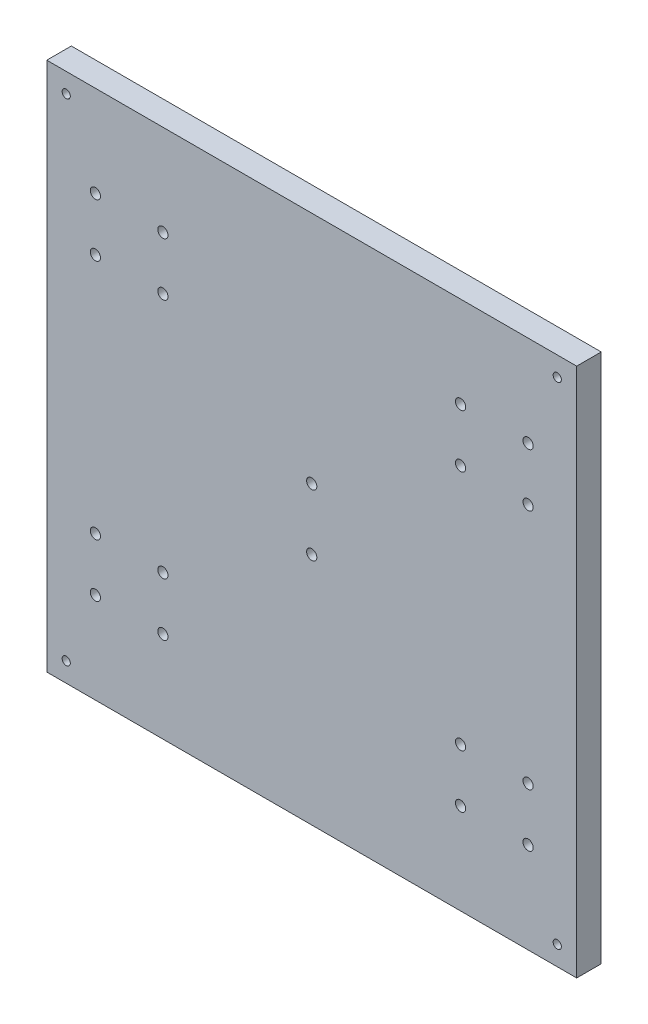
ISO-10303-21;
HEADER;
FILE_DESCRIPTION(('STEP AP214'),'2;1');
FILE_NAME('part.step','',(''),(''),'','','');
FILE_SCHEMA(('AUTOMOTIVE_DESIGN { 1 0 10303 214 1 1 1 1 }'));
ENDSEC;
DATA;
#1=APPLICATION_CONTEXT('core data for automotive mechanical design processes');
#2=APPLICATION_PROTOCOL_DEFINITION('international standard','automotive_design',2000,#1);
#3=PRODUCT_CONTEXT('',#1,'mechanical');
#4=PRODUCT('Part','Part','',(#3));
#5=PRODUCT_RELATED_PRODUCT_CATEGORY('part','',(#4));
#6=PRODUCT_DEFINITION_FORMATION('','',#4);
#7=PRODUCT_DEFINITION_CONTEXT('part definition',#1,'design');
#8=PRODUCT_DEFINITION('design','',#6,#7);
#9=PRODUCT_DEFINITION_SHAPE('','',#8);
#10=(LENGTH_UNIT() NAMED_UNIT(*) SI_UNIT(.MILLI.,.METRE.));
#11=(NAMED_UNIT(*) PLANE_ANGLE_UNIT() SI_UNIT($,.RADIAN.));
#12=(NAMED_UNIT(*) SI_UNIT($,.STERADIAN.) SOLID_ANGLE_UNIT());
#13=UNCERTAINTY_MEASURE_WITH_UNIT(LENGTH_MEASURE(1.E-05),#10,'distance_accuracy_value','');
#14=(GEOMETRIC_REPRESENTATION_CONTEXT(3) GLOBAL_UNCERTAINTY_ASSIGNED_CONTEXT((#13)) GLOBAL_UNIT_ASSIGNED_CONTEXT((#10,
#11,#12)) REPRESENTATION_CONTEXT('',''));
#15=CARTESIAN_POINT('',(0.,0.,0.));
#16=DIRECTION('',(0.,0.,1.));
#17=DIRECTION('',(1.,0.,0.));
#18=AXIS2_PLACEMENT_3D('',#15,#16,#17);
#19=CARTESIAN_POINT('',(0.,0.,12.));
#20=DIRECTION('',(0.,0.,-1.));
#21=DIRECTION('',(-1.,0.,0.));
#22=AXIS2_PLACEMENT_3D('',#19,#20,#21);
#23=PLANE('',#22);
#24=CARTESIAN_POINT('',(0.,15.,12.));
#25=DIRECTION('',(0.,0.,1.));
#26=DIRECTION('',(1.,0.,0.));
#27=AXIS2_PLACEMENT_3D('',#24,#25,#26);
#28=CIRCLE('',#27,2.5);
#29=CARTESIAN_POINT('',(2.50000000000001,15.,12.));
#30=VERTEX_POINT('',#29);
#31=EDGE_CURVE('E250',#30,#30,#28,.T.);
#32=ORIENTED_EDGE('',*,*,#31,.F.);
#33=EDGE_LOOP('',(#32));
#34=FACE_BOUND('',#33,.T.);
#35=CARTESIAN_POINT('',(0.,-15.,12.));
#36=DIRECTION('',(0.,0.,1.));
#37=DIRECTION('',(1.,0.,0.));
#38=AXIS2_PLACEMENT_3D('',#35,#36,#37);
#39=CIRCLE('',#38,2.5);
#40=CARTESIAN_POINT('',(2.50000000000002,-15.,12.));
#41=VERTEX_POINT('',#40);
#42=EDGE_CURVE('E254',#41,#41,#39,.T.);
#43=ORIENTED_EDGE('',*,*,#42,.F.);
#44=EDGE_LOOP('',(#43));
#45=FACE_BOUND('',#44,.T.);
#46=CARTESIAN_POINT('',(-105.75,85.,12.));
#47=DIRECTION('',(0.,0.,1.));
#48=DIRECTION('',(1.,0.,0.));
#49=AXIS2_PLACEMENT_3D('',#46,#47,#48);
#50=CIRCLE('',#49,2.5);
#51=CARTESIAN_POINT('',(-103.25,85.,12.));
#52=VERTEX_POINT('',#51);
#53=EDGE_CURVE('E12',#52,#52,#50,.T.);
#54=ORIENTED_EDGE('',*,*,#53,.F.);
#55=EDGE_LOOP('',(#54));
#56=FACE_BOUND('',#55,.T.);
#57=CARTESIAN_POINT('',(-72.75,85.,12.));
#58=DIRECTION('',(0.,0.,1.));
#59=DIRECTION('',(1.,0.,0.));
#60=AXIS2_PLACEMENT_3D('',#57,#58,#59);
#61=CIRCLE('',#60,2.5);
#62=CARTESIAN_POINT('',(-70.25,85.,12.));
#63=VERTEX_POINT('',#62);
#64=EDGE_CURVE('E218',#63,#63,#61,.T.);
#65=ORIENTED_EDGE('',*,*,#64,.F.);
#66=EDGE_LOOP('',(#65));
#67=FACE_BOUND('',#66,.T.);
#68=CARTESIAN_POINT('',(-105.75,59.,12.));
#69=DIRECTION('',(0.,0.,1.));
#70=DIRECTION('',(1.,0.,0.));
#71=AXIS2_PLACEMENT_3D('',#68,#69,#70);
#72=CIRCLE('',#71,2.5);
#73=CARTESIAN_POINT('',(-103.25,59.,12.));
#74=VERTEX_POINT('',#73);
#75=EDGE_CURVE('E212',#74,#74,#72,.T.);
#76=ORIENTED_EDGE('',*,*,#75,.F.);
#77=EDGE_LOOP('',(#76));
#78=FACE_BOUND('',#77,.T.);
#79=CARTESIAN_POINT('',(-72.75,59.,12.));
#80=DIRECTION('',(0.,0.,1.));
#81=DIRECTION('',(1.,0.,0.));
#82=AXIS2_PLACEMENT_3D('',#79,#80,#81);
#83=CIRCLE('',#82,2.5);
#84=CARTESIAN_POINT('',(-70.25,59.,12.));
#85=VERTEX_POINT('',#84);
#86=EDGE_CURVE('E206',#85,#85,#83,.T.);
#87=ORIENTED_EDGE('',*,*,#86,.F.);
#88=EDGE_LOOP('',(#87));
#89=FACE_BOUND('',#88,.T.);
#90=CARTESIAN_POINT('',(-120.,120.,12.));
#91=DIRECTION('',(0.,0.,1.));
#92=DIRECTION('',(1.,0.,0.));
#93=AXIS2_PLACEMENT_3D('',#90,#91,#92);
#94=CIRCLE('',#93,2.);
#95=CARTESIAN_POINT('',(-118.,120.,12.));
#96=VERTEX_POINT('',#95);
#97=EDGE_CURVE('E200',#96,#96,#94,.T.);
#98=ORIENTED_EDGE('',*,*,#97,.F.);
#99=EDGE_LOOP('',(#98));
#100=FACE_BOUND('',#99,.T.);
#101=CARTESIAN_POINT('',(-105.75,-59.,12.));
#102=DIRECTION('',(0.,0.,1.));
#103=DIRECTION('',(-1.,0.,0.));
#104=AXIS2_PLACEMENT_3D('',#101,#102,#103);
#105=CIRCLE('',#104,2.5);
#106=CARTESIAN_POINT('',(-108.25,-59.,12.));
#107=VERTEX_POINT('',#106);
#108=EDGE_CURVE('E194',#107,#107,#105,.T.);
#109=ORIENTED_EDGE('',*,*,#108,.F.);
#110=EDGE_LOOP('',(#109));
#111=FACE_BOUND('',#110,.T.);
#112=CARTESIAN_POINT('',(-105.75,-85.,12.));
#113=DIRECTION('',(0.,0.,1.));
#114=DIRECTION('',(-1.,0.,0.));
#115=AXIS2_PLACEMENT_3D('',#112,#113,#114);
#116=CIRCLE('',#115,2.5);
#117=CARTESIAN_POINT('',(-108.25,-85.,12.));
#118=VERTEX_POINT('',#117);
#119=EDGE_CURVE('E188',#118,#118,#116,.T.);
#120=ORIENTED_EDGE('',*,*,#119,.F.);
#121=EDGE_LOOP('',(#120));
#122=FACE_BOUND('',#121,.T.);
#123=CARTESIAN_POINT('',(-120.,-120.,12.));
#124=DIRECTION('',(0.,0.,1.));
#125=DIRECTION('',(-1.,0.,0.));
#126=AXIS2_PLACEMENT_3D('',#123,#124,#125);
#127=CIRCLE('',#126,2.);
#128=CARTESIAN_POINT('',(-122.,-120.,12.));
#129=VERTEX_POINT('',#128);
#130=EDGE_CURVE('E182',#129,#129,#127,.T.);
#131=ORIENTED_EDGE('',*,*,#130,.F.);
#132=EDGE_LOOP('',(#131));
#133=FACE_BOUND('',#132,.T.);
#134=CARTESIAN_POINT('',(-72.75,-59.,12.));
#135=DIRECTION('',(0.,0.,1.));
#136=DIRECTION('',(-1.,0.,0.));
#137=AXIS2_PLACEMENT_3D('',#134,#135,#136);
#138=CIRCLE('',#137,2.5);
#139=CARTESIAN_POINT('',(-75.25,-59.,12.));
#140=VERTEX_POINT('',#139);
#141=EDGE_CURVE('E176',#140,#140,#138,.T.);
#142=ORIENTED_EDGE('',*,*,#141,.F.);
#143=EDGE_LOOP('',(#142));
#144=FACE_BOUND('',#143,.T.);
#145=CARTESIAN_POINT('',(-72.75,-85.,12.));
#146=DIRECTION('',(0.,0.,1.));
#147=DIRECTION('',(-1.,0.,0.));
#148=AXIS2_PLACEMENT_3D('',#145,#146,#147);
#149=CIRCLE('',#148,2.5);
#150=CARTESIAN_POINT('',(-75.25,-85.,12.));
#151=VERTEX_POINT('',#150);
#152=EDGE_CURVE('E170',#151,#151,#149,.T.);
#153=ORIENTED_EDGE('',*,*,#152,.F.);
#154=EDGE_LOOP('',(#153));
#155=FACE_BOUND('',#154,.T.);
#156=CARTESIAN_POINT('',(72.75,-85.,12.));
#157=DIRECTION('',(0.,0.,1.));
#158=DIRECTION('',(1.,0.,0.));
#159=AXIS2_PLACEMENT_3D('',#156,#157,#158);
#160=CIRCLE('',#159,2.5);
#161=CARTESIAN_POINT('',(75.25,-85.,12.));
#162=VERTEX_POINT('',#161);
#163=EDGE_CURVE('E164',#162,#162,#160,.T.);
#164=ORIENTED_EDGE('',*,*,#163,.F.);
#165=EDGE_LOOP('',(#164));
#166=FACE_BOUND('',#165,.T.);
#167=CARTESIAN_POINT('',(72.75,-59.,12.));
#168=DIRECTION('',(0.,0.,1.));
#169=DIRECTION('',(1.,0.,0.));
#170=AXIS2_PLACEMENT_3D('',#167,#168,#169);
#171=CIRCLE('',#170,2.5);
#172=CARTESIAN_POINT('',(75.25,-59.,12.));
#173=VERTEX_POINT('',#172);
#174=EDGE_CURVE('E158',#173,#173,#171,.T.);
#175=ORIENTED_EDGE('',*,*,#174,.F.);
#176=EDGE_LOOP('',(#175));
#177=FACE_BOUND('',#176,.T.);
#178=CARTESIAN_POINT('',(120.,-120.,12.));
#179=DIRECTION('',(0.,0.,1.));
#180=DIRECTION('',(1.,0.,0.));
#181=AXIS2_PLACEMENT_3D('',#178,#179,#180);
#182=CIRCLE('',#181,2.);
#183=CARTESIAN_POINT('',(122.,-120.,12.));
#184=VERTEX_POINT('',#183);
#185=EDGE_CURVE('E152',#184,#184,#182,.T.);
#186=ORIENTED_EDGE('',*,*,#185,.F.);
#187=EDGE_LOOP('',(#186));
#188=FACE_BOUND('',#187,.T.);
#189=CARTESIAN_POINT('',(105.75,-85.,12.));
#190=DIRECTION('',(0.,0.,1.));
#191=DIRECTION('',(1.,0.,0.));
#192=AXIS2_PLACEMENT_3D('',#189,#190,#191);
#193=CIRCLE('',#192,2.5);
#194=CARTESIAN_POINT('',(108.25,-85.,12.));
#195=VERTEX_POINT('',#194);
#196=EDGE_CURVE('E146',#195,#195,#193,.T.);
#197=ORIENTED_EDGE('',*,*,#196,.F.);
#198=EDGE_LOOP('',(#197));
#199=FACE_BOUND('',#198,.T.);
#200=CARTESIAN_POINT('',(105.75,-59.,12.));
#201=DIRECTION('',(0.,0.,1.));
#202=DIRECTION('',(1.,0.,0.));
#203=AXIS2_PLACEMENT_3D('',#200,#201,#202);
#204=CIRCLE('',#203,2.5);
#205=CARTESIAN_POINT('',(108.25,-59.,12.));
#206=VERTEX_POINT('',#205);
#207=EDGE_CURVE('E140',#206,#206,#204,.T.);
#208=ORIENTED_EDGE('',*,*,#207,.F.);
#209=EDGE_LOOP('',(#208));
#210=FACE_BOUND('',#209,.T.);
#211=CARTESIAN_POINT('',(120.,120.,12.));
#212=DIRECTION('',(0.,0.,1.));
#213=DIRECTION('',(-1.,0.,0.));
#214=AXIS2_PLACEMENT_3D('',#211,#212,#213);
#215=CIRCLE('',#214,2.);
#216=CARTESIAN_POINT('',(118.,120.,12.));
#217=VERTEX_POINT('',#216);
#218=EDGE_CURVE('E134',#217,#217,#215,.T.);
#219=ORIENTED_EDGE('',*,*,#218,.F.);
#220=EDGE_LOOP('',(#219));
#221=FACE_BOUND('',#220,.T.);
#222=CARTESIAN_POINT('',(72.75,59.,12.));
#223=DIRECTION('',(0.,0.,1.));
#224=DIRECTION('',(-1.,0.,0.));
#225=AXIS2_PLACEMENT_3D('',#222,#223,#224);
#226=CIRCLE('',#225,2.5);
#227=CARTESIAN_POINT('',(70.25,59.,12.));
#228=VERTEX_POINT('',#227);
#229=EDGE_CURVE('E128',#228,#228,#226,.T.);
#230=ORIENTED_EDGE('',*,*,#229,.F.);
#231=EDGE_LOOP('',(#230));
#232=FACE_BOUND('',#231,.T.);
#233=CARTESIAN_POINT('',(105.75,59.,12.));
#234=DIRECTION('',(0.,0.,1.));
#235=DIRECTION('',(-1.,0.,0.));
#236=AXIS2_PLACEMENT_3D('',#233,#234,#235);
#237=CIRCLE('',#236,2.5);
#238=CARTESIAN_POINT('',(103.25,59.,12.));
#239=VERTEX_POINT('',#238);
#240=EDGE_CURVE('E122',#239,#239,#237,.T.);
#241=ORIENTED_EDGE('',*,*,#240,.F.);
#242=EDGE_LOOP('',(#241));
#243=FACE_BOUND('',#242,.T.);
#244=CARTESIAN_POINT('',(72.75,85.,12.));
#245=DIRECTION('',(0.,0.,1.));
#246=DIRECTION('',(-1.,0.,0.));
#247=AXIS2_PLACEMENT_3D('',#244,#245,#246);
#248=CIRCLE('',#247,2.5);
#249=CARTESIAN_POINT('',(70.25,85.,12.));
#250=VERTEX_POINT('',#249);
#251=EDGE_CURVE('E116',#250,#250,#248,.T.);
#252=ORIENTED_EDGE('',*,*,#251,.F.);
#253=EDGE_LOOP('',(#252));
#254=FACE_BOUND('',#253,.T.);
#255=CARTESIAN_POINT('',(105.75,85.,12.));
#256=DIRECTION('',(0.,0.,1.));
#257=DIRECTION('',(-1.,0.,0.));
#258=AXIS2_PLACEMENT_3D('',#255,#256,#257);
#259=CIRCLE('',#258,2.5);
#260=CARTESIAN_POINT('',(103.25,85.,12.));
#261=VERTEX_POINT('',#260);
#262=EDGE_CURVE('E110',#261,#261,#259,.T.);
#263=ORIENTED_EDGE('',*,*,#262,.F.);
#264=EDGE_LOOP('',(#263));
#265=FACE_BOUND('',#264,.T.);
#266=DIRECTION('',(0.,1.,0.));
#267=VECTOR('',#266,1.);
#268=CARTESIAN_POINT('',(129.5,-129.5,12.));
#269=LINE('',#268,#267);
#270=CARTESIAN_POINT('',(129.5,-129.5,12.));
#271=VERTEX_POINT('',#270);
#272=CARTESIAN_POINT('',(129.5,129.5,12.));
#273=VERTEX_POINT('',#272);
#274=EDGE_CURVE('E98',#271,#273,#269,.T.);
#275=ORIENTED_EDGE('',*,*,#274,.T.);
#276=DIRECTION('',(-1.,0.,0.));
#277=VECTOR('',#276,1.);
#278=CARTESIAN_POINT('',(-129.5,129.5,12.));
#279=LINE('',#278,#277);
#280=CARTESIAN_POINT('',(-129.5,129.5,12.));
#281=VERTEX_POINT('',#280);
#282=EDGE_CURVE('E101',#273,#281,#279,.T.);
#283=ORIENTED_EDGE('',*,*,#282,.T.);
#284=DIRECTION('',(0.,-1.,0.));
#285=VECTOR('',#284,1.);
#286=CARTESIAN_POINT('',(-129.5,-129.5,12.));
#287=LINE('',#286,#285);
#288=CARTESIAN_POINT('',(-129.5,-129.5,12.));
#289=VERTEX_POINT('',#288);
#290=EDGE_CURVE('E49',#281,#289,#287,.T.);
#291=ORIENTED_EDGE('',*,*,#290,.T.);
#292=DIRECTION('',(1.,0.,0.));
#293=VECTOR('',#292,1.);
#294=CARTESIAN_POINT('',(-129.5,-129.5,12.));
#295=LINE('',#294,#293);
#296=EDGE_CURVE('E81',#289,#271,#295,.T.);
#297=ORIENTED_EDGE('',*,*,#296,.T.);
#298=EDGE_LOOP('',(#275,#283,#291,#297));
#299=FACE_BOUND('',#298,.T.);
#300=ADVANCED_FACE('F34',(#34,#45,#56,#67,#78,#89,#100,#111,#122,#133,#144,#155,#166,#177,#188,
#199,#210,#221,#232,#243,#254,#265,#299),#23,.F.);
#301=CARTESIAN_POINT('',(0.,0.,0.));
#302=DIRECTION('',(0.,0.,-1.));
#303=DIRECTION('',(-1.,0.,0.));
#304=AXIS2_PLACEMENT_3D('',#301,#302,#303);
#305=PLANE('',#304);
#306=CARTESIAN_POINT('',(0.,15.,0.));
#307=DIRECTION('',(0.,0.,1.));
#308=DIRECTION('',(1.,0.,0.));
#309=AXIS2_PLACEMENT_3D('',#306,#307,#308);
#310=CIRCLE('',#309,2.5);
#311=CARTESIAN_POINT('',(2.50000000000001,15.,0.));
#312=VERTEX_POINT('',#311);
#313=EDGE_CURVE('E102',#312,#312,#310,.T.);
#314=ORIENTED_EDGE('',*,*,#313,.T.);
#315=EDGE_LOOP('',(#314));
#316=FACE_BOUND('',#315,.T.);
#317=CARTESIAN_POINT('',(0.,-15.,0.));
#318=DIRECTION('',(0.,0.,1.));
#319=DIRECTION('',(1.,0.,0.));
#320=AXIS2_PLACEMENT_3D('',#317,#318,#319);
#321=CIRCLE('',#320,2.5);
#322=CARTESIAN_POINT('',(2.50000000000002,-15.,0.));
#323=VERTEX_POINT('',#322);
#324=EDGE_CURVE('E303',#323,#323,#321,.T.);
#325=ORIENTED_EDGE('',*,*,#324,.T.);
#326=EDGE_LOOP('',(#325));
#327=FACE_BOUND('',#326,.T.);
#328=CARTESIAN_POINT('',(105.75,85.,0.));
#329=DIRECTION('',(0.,0.,1.));
#330=DIRECTION('',(-1.,0.,0.));
#331=AXIS2_PLACEMENT_3D('',#328,#329,#330);
#332=CIRCLE('',#331,2.5);
#333=CARTESIAN_POINT('',(103.25,85.,0.));
#334=VERTEX_POINT('',#333);
#335=EDGE_CURVE('E107',#334,#334,#332,.T.);
#336=ORIENTED_EDGE('',*,*,#335,.T.);
#337=EDGE_LOOP('',(#336));
#338=FACE_BOUND('',#337,.T.);
#339=CARTESIAN_POINT('',(105.75,59.,0.));
#340=DIRECTION('',(0.,0.,1.));
#341=DIRECTION('',(-1.,0.,0.));
#342=AXIS2_PLACEMENT_3D('',#339,#340,#341);
#343=CIRCLE('',#342,2.5);
#344=CARTESIAN_POINT('',(103.25,59.,0.));
#345=VERTEX_POINT('',#344);
#346=EDGE_CURVE('E119',#345,#345,#343,.T.);
#347=ORIENTED_EDGE('',*,*,#346,.T.);
#348=EDGE_LOOP('',(#347));
#349=FACE_BOUND('',#348,.T.);
#350=CARTESIAN_POINT('',(120.,120.,0.));
#351=DIRECTION('',(0.,0.,1.));
#352=DIRECTION('',(-1.,0.,0.));
#353=AXIS2_PLACEMENT_3D('',#350,#351,#352);
#354=CIRCLE('',#353,2.);
#355=CARTESIAN_POINT('',(118.,120.,0.));
#356=VERTEX_POINT('',#355);
#357=EDGE_CURVE('E131',#356,#356,#354,.T.);
#358=ORIENTED_EDGE('',*,*,#357,.T.);
#359=EDGE_LOOP('',(#358));
#360=FACE_BOUND('',#359,.T.);
#361=CARTESIAN_POINT('',(105.75,-85.,0.));
#362=DIRECTION('',(0.,0.,1.));
#363=DIRECTION('',(1.,0.,0.));
#364=AXIS2_PLACEMENT_3D('',#361,#362,#363);
#365=CIRCLE('',#364,2.5);
#366=CARTESIAN_POINT('',(108.25,-85.,0.));
#367=VERTEX_POINT('',#366);
#368=EDGE_CURVE('E143',#367,#367,#365,.T.);
#369=ORIENTED_EDGE('',*,*,#368,.T.);
#370=EDGE_LOOP('',(#369));
#371=FACE_BOUND('',#370,.T.);
#372=CARTESIAN_POINT('',(72.75,-59.,0.));
#373=DIRECTION('',(0.,0.,1.));
#374=DIRECTION('',(1.,0.,0.));
#375=AXIS2_PLACEMENT_3D('',#372,#373,#374);
#376=CIRCLE('',#375,2.5);
#377=CARTESIAN_POINT('',(75.25,-59.,0.));
#378=VERTEX_POINT('',#377);
#379=EDGE_CURVE('E155',#378,#378,#376,.T.);
#380=ORIENTED_EDGE('',*,*,#379,.T.);
#381=EDGE_LOOP('',(#380));
#382=FACE_BOUND('',#381,.T.);
#383=CARTESIAN_POINT('',(-72.75,-85.,0.));
#384=DIRECTION('',(0.,0.,1.));
#385=DIRECTION('',(-1.,0.,0.));
#386=AXIS2_PLACEMENT_3D('',#383,#384,#385);
#387=CIRCLE('',#386,2.5);
#388=CARTESIAN_POINT('',(-75.25,-85.,0.));
#389=VERTEX_POINT('',#388);
#390=EDGE_CURVE('E167',#389,#389,#387,.T.);
#391=ORIENTED_EDGE('',*,*,#390,.T.);
#392=EDGE_LOOP('',(#391));
#393=FACE_BOUND('',#392,.T.);
#394=CARTESIAN_POINT('',(-120.,-120.,0.));
#395=DIRECTION('',(0.,0.,1.));
#396=DIRECTION('',(-1.,0.,0.));
#397=AXIS2_PLACEMENT_3D('',#394,#395,#396);
#398=CIRCLE('',#397,2.);
#399=CARTESIAN_POINT('',(-122.,-120.,0.));
#400=VERTEX_POINT('',#399);
#401=EDGE_CURVE('E179',#400,#400,#398,.T.);
#402=ORIENTED_EDGE('',*,*,#401,.T.);
#403=EDGE_LOOP('',(#402));
#404=FACE_BOUND('',#403,.T.);
#405=CARTESIAN_POINT('',(-105.75,-59.,0.));
#406=DIRECTION('',(0.,0.,1.));
#407=DIRECTION('',(-1.,0.,0.));
#408=AXIS2_PLACEMENT_3D('',#405,#406,#407);
#409=CIRCLE('',#408,2.5);
#410=CARTESIAN_POINT('',(-108.25,-59.,0.));
#411=VERTEX_POINT('',#410);
#412=EDGE_CURVE('E191',#411,#411,#409,.T.);
#413=ORIENTED_EDGE('',*,*,#412,.T.);
#414=EDGE_LOOP('',(#413));
#415=FACE_BOUND('',#414,.T.);
#416=CARTESIAN_POINT('',(-72.75,59.,0.));
#417=DIRECTION('',(0.,0.,1.));
#418=DIRECTION('',(1.,0.,0.));
#419=AXIS2_PLACEMENT_3D('',#416,#417,#418);
#420=CIRCLE('',#419,2.5);
#421=CARTESIAN_POINT('',(-70.25,59.,0.));
#422=VERTEX_POINT('',#421);
#423=EDGE_CURVE('E203',#422,#422,#420,.T.);
#424=ORIENTED_EDGE('',*,*,#423,.T.);
#425=EDGE_LOOP('',(#424));
#426=FACE_BOUND('',#425,.T.);
#427=CARTESIAN_POINT('',(-72.75,85.,0.));
#428=DIRECTION('',(0.,0.,1.));
#429=DIRECTION('',(1.,0.,0.));
#430=AXIS2_PLACEMENT_3D('',#427,#428,#429);
#431=CIRCLE('',#430,2.5);
#432=CARTESIAN_POINT('',(-70.25,85.,0.));
#433=VERTEX_POINT('',#432);
#434=EDGE_CURVE('E215',#433,#433,#431,.T.);
#435=ORIENTED_EDGE('',*,*,#434,.T.);
#436=EDGE_LOOP('',(#435));
#437=FACE_BOUND('',#436,.T.);
#438=CARTESIAN_POINT('',(-105.75,85.,0.));
#439=DIRECTION('',(0.,0.,1.));
#440=DIRECTION('',(1.,0.,0.));
#441=AXIS2_PLACEMENT_3D('',#438,#439,#440);
#442=CIRCLE('',#441,2.5);
#443=CARTESIAN_POINT('',(-103.25,85.,0.));
#444=VERTEX_POINT('',#443);
#445=EDGE_CURVE('E38',#444,#444,#442,.T.);
#446=ORIENTED_EDGE('',*,*,#445,.T.);
#447=EDGE_LOOP('',(#446));
#448=FACE_BOUND('',#447,.T.);
#449=CARTESIAN_POINT('',(-105.75,59.,0.));
#450=DIRECTION('',(0.,0.,1.));
#451=DIRECTION('',(1.,0.,0.));
#452=AXIS2_PLACEMENT_3D('',#449,#450,#451);
#453=CIRCLE('',#452,2.5);
#454=CARTESIAN_POINT('',(-103.25,59.,0.));
#455=VERTEX_POINT('',#454);
#456=EDGE_CURVE('E209',#455,#455,#453,.T.);
#457=ORIENTED_EDGE('',*,*,#456,.T.);
#458=EDGE_LOOP('',(#457));
#459=FACE_BOUND('',#458,.T.);
#460=CARTESIAN_POINT('',(-120.,120.,0.));
#461=DIRECTION('',(0.,0.,1.));
#462=DIRECTION('',(1.,0.,0.));
#463=AXIS2_PLACEMENT_3D('',#460,#461,#462);
#464=CIRCLE('',#463,2.);
#465=CARTESIAN_POINT('',(-118.,120.,0.));
#466=VERTEX_POINT('',#465);
#467=EDGE_CURVE('E197',#466,#466,#464,.T.);
#468=ORIENTED_EDGE('',*,*,#467,.T.);
#469=EDGE_LOOP('',(#468));
#470=FACE_BOUND('',#469,.T.);
#471=CARTESIAN_POINT('',(-105.75,-85.,0.));
#472=DIRECTION('',(0.,0.,1.));
#473=DIRECTION('',(-1.,0.,0.));
#474=AXIS2_PLACEMENT_3D('',#471,#472,#473);
#475=CIRCLE('',#474,2.5);
#476=CARTESIAN_POINT('',(-108.25,-85.,0.));
#477=VERTEX_POINT('',#476);
#478=EDGE_CURVE('E185',#477,#477,#475,.T.);
#479=ORIENTED_EDGE('',*,*,#478,.T.);
#480=EDGE_LOOP('',(#479));
#481=FACE_BOUND('',#480,.T.);
#482=CARTESIAN_POINT('',(-72.75,-59.,0.));
#483=DIRECTION('',(0.,0.,1.));
#484=DIRECTION('',(-1.,0.,0.));
#485=AXIS2_PLACEMENT_3D('',#482,#483,#484);
#486=CIRCLE('',#485,2.5);
#487=CARTESIAN_POINT('',(-75.25,-59.,0.));
#488=VERTEX_POINT('',#487);
#489=EDGE_CURVE('E173',#488,#488,#486,.T.);
#490=ORIENTED_EDGE('',*,*,#489,.T.);
#491=EDGE_LOOP('',(#490));
#492=FACE_BOUND('',#491,.T.);
#493=CARTESIAN_POINT('',(72.75,-85.,0.));
#494=DIRECTION('',(0.,0.,1.));
#495=DIRECTION('',(1.,0.,0.));
#496=AXIS2_PLACEMENT_3D('',#493,#494,#495);
#497=CIRCLE('',#496,2.5);
#498=CARTESIAN_POINT('',(75.25,-85.,0.));
#499=VERTEX_POINT('',#498);
#500=EDGE_CURVE('E161',#499,#499,#497,.T.);
#501=ORIENTED_EDGE('',*,*,#500,.T.);
#502=EDGE_LOOP('',(#501));
#503=FACE_BOUND('',#502,.T.);
#504=CARTESIAN_POINT('',(120.,-120.,0.));
#505=DIRECTION('',(0.,0.,1.));
#506=DIRECTION('',(1.,0.,0.));
#507=AXIS2_PLACEMENT_3D('',#504,#505,#506);
#508=CIRCLE('',#507,2.);
#509=CARTESIAN_POINT('',(122.,-120.,0.));
#510=VERTEX_POINT('',#509);
#511=EDGE_CURVE('E149',#510,#510,#508,.T.);
#512=ORIENTED_EDGE('',*,*,#511,.T.);
#513=EDGE_LOOP('',(#512));
#514=FACE_BOUND('',#513,.T.);
#515=CARTESIAN_POINT('',(105.75,-59.,0.));
#516=DIRECTION('',(0.,0.,1.));
#517=DIRECTION('',(1.,0.,0.));
#518=AXIS2_PLACEMENT_3D('',#515,#516,#517);
#519=CIRCLE('',#518,2.5);
#520=CARTESIAN_POINT('',(108.25,-59.,0.));
#521=VERTEX_POINT('',#520);
#522=EDGE_CURVE('E137',#521,#521,#519,.T.);
#523=ORIENTED_EDGE('',*,*,#522,.T.);
#524=EDGE_LOOP('',(#523));
#525=FACE_BOUND('',#524,.T.);
#526=CARTESIAN_POINT('',(72.75,59.,0.));
#527=DIRECTION('',(0.,0.,1.));
#528=DIRECTION('',(-1.,0.,0.));
#529=AXIS2_PLACEMENT_3D('',#526,#527,#528);
#530=CIRCLE('',#529,2.5);
#531=CARTESIAN_POINT('',(70.25,59.,0.));
#532=VERTEX_POINT('',#531);
#533=EDGE_CURVE('E125',#532,#532,#530,.T.);
#534=ORIENTED_EDGE('',*,*,#533,.T.);
#535=EDGE_LOOP('',(#534));
#536=FACE_BOUND('',#535,.T.);
#537=CARTESIAN_POINT('',(72.75,85.,0.));
#538=DIRECTION('',(0.,0.,1.));
#539=DIRECTION('',(-1.,0.,0.));
#540=AXIS2_PLACEMENT_3D('',#537,#538,#539);
#541=CIRCLE('',#540,2.5);
#542=CARTESIAN_POINT('',(70.25,85.,0.));
#543=VERTEX_POINT('',#542);
#544=EDGE_CURVE('E113',#543,#543,#541,.T.);
#545=ORIENTED_EDGE('',*,*,#544,.T.);
#546=EDGE_LOOP('',(#545));
#547=FACE_BOUND('',#546,.T.);
#548=DIRECTION('',(-1.,0.,0.));
#549=VECTOR('',#548,1.);
#550=CARTESIAN_POINT('',(-129.5,129.5,0.));
#551=LINE('',#550,#549);
#552=CARTESIAN_POINT('',(129.5,129.5,0.));
#553=VERTEX_POINT('',#552);
#554=CARTESIAN_POINT('',(-129.5,129.5,0.));
#555=VERTEX_POINT('',#554);
#556=EDGE_CURVE('E91',#553,#555,#551,.T.);
#557=ORIENTED_EDGE('',*,*,#556,.F.);
#558=DIRECTION('',(0.,1.,0.));
#559=VECTOR('',#558,1.);
#560=CARTESIAN_POINT('',(129.5,-129.5,0.));
#561=LINE('',#560,#559);
#562=CARTESIAN_POINT('',(129.5,-129.5,0.));
#563=VERTEX_POINT('',#562);
#564=EDGE_CURVE('E57',#563,#553,#561,.T.);
#565=ORIENTED_EDGE('',*,*,#564,.F.);
#566=DIRECTION('',(1.,0.,0.));
#567=VECTOR('',#566,1.);
#568=CARTESIAN_POINT('',(-129.5,-129.5,0.));
#569=LINE('',#568,#567);
#570=CARTESIAN_POINT('',(-129.5,-129.5,0.));
#571=VERTEX_POINT('',#570);
#572=EDGE_CURVE('E79',#571,#563,#569,.T.);
#573=ORIENTED_EDGE('',*,*,#572,.F.);
#574=DIRECTION('',(0.,-1.,0.));
#575=VECTOR('',#574,1.);
#576=CARTESIAN_POINT('',(-129.5,-129.5,0.));
#577=LINE('',#576,#575);
#578=EDGE_CURVE('E86',#555,#571,#577,.T.);
#579=ORIENTED_EDGE('',*,*,#578,.F.);
#580=EDGE_LOOP('',(#557,#565,#573,#579));
#581=FACE_BOUND('',#580,.T.);
#582=ADVANCED_FACE('F36',(#316,#327,#338,#349,#360,#371,#382,#393,#404,#415,#426,#437,#448,#459,
#470,#481,#492,#503,#514,#525,#536,#547,#581),#305,.T.);
#583=CARTESIAN_POINT('',(-105.75,85.,12.));
#584=DIRECTION('',(0.,0.,-1.));
#585=DIRECTION('',(-1.,0.,0.));
#586=AXIS2_PLACEMENT_3D('',#583,#584,#585);
#587=CYLINDRICAL_SURFACE('',#586,2.5);
#588=ORIENTED_EDGE('',*,*,#53,.T.);
#589=EDGE_LOOP('',(#588));
#590=FACE_BOUND('',#589,.T.);
#591=ORIENTED_EDGE('',*,*,#445,.F.);
#592=EDGE_LOOP('',(#591));
#593=FACE_BOUND('',#592,.T.);
#594=ADVANCED_FACE('F229',(#590,#593),#587,.F.);
#595=CARTESIAN_POINT('',(-72.75,85.,12.));
#596=DIRECTION('',(0.,0.,-1.));
#597=DIRECTION('',(-1.,0.,0.));
#598=AXIS2_PLACEMENT_3D('',#595,#596,#597);
#599=CYLINDRICAL_SURFACE('',#598,2.5);
#600=ORIENTED_EDGE('',*,*,#64,.T.);
#601=EDGE_LOOP('',(#600));
#602=FACE_BOUND('',#601,.T.);
#603=ORIENTED_EDGE('',*,*,#434,.F.);
#604=EDGE_LOOP('',(#603));
#605=FACE_BOUND('',#604,.T.);
#606=ADVANCED_FACE('F226',(#602,#605),#599,.F.);
#607=CARTESIAN_POINT('',(-105.75,59.,12.));
#608=DIRECTION('',(0.,0.,-1.));
#609=DIRECTION('',(-1.,0.,0.));
#610=AXIS2_PLACEMENT_3D('',#607,#608,#609);
#611=CYLINDRICAL_SURFACE('',#610,2.5);
#612=ORIENTED_EDGE('',*,*,#75,.T.);
#613=EDGE_LOOP('',(#612));
#614=FACE_BOUND('',#613,.T.);
#615=ORIENTED_EDGE('',*,*,#456,.F.);
#616=EDGE_LOOP('',(#615));
#617=FACE_BOUND('',#616,.T.);
#618=ADVANCED_FACE('F228',(#614,#617),#611,.F.);
#619=CARTESIAN_POINT('',(-72.75,59.,12.));
#620=DIRECTION('',(0.,0.,-1.));
#621=DIRECTION('',(-1.,0.,0.));
#622=AXIS2_PLACEMENT_3D('',#619,#620,#621);
#623=CYLINDRICAL_SURFACE('',#622,2.5);
#624=ORIENTED_EDGE('',*,*,#86,.T.);
#625=EDGE_LOOP('',(#624));
#626=FACE_BOUND('',#625,.T.);
#627=ORIENTED_EDGE('',*,*,#423,.F.);
#628=EDGE_LOOP('',(#627));
#629=FACE_BOUND('',#628,.T.);
#630=ADVANCED_FACE('F236',(#626,#629),#623,.F.);
#631=CARTESIAN_POINT('',(-120.,120.,12.));
#632=DIRECTION('',(0.,0.,-1.));
#633=DIRECTION('',(-1.,0.,0.));
#634=AXIS2_PLACEMENT_3D('',#631,#632,#633);
#635=CYLINDRICAL_SURFACE('',#634,2.);
#636=ORIENTED_EDGE('',*,*,#97,.T.);
#637=EDGE_LOOP('',(#636));
#638=FACE_BOUND('',#637,.T.);
#639=ORIENTED_EDGE('',*,*,#467,.F.);
#640=EDGE_LOOP('',(#639));
#641=FACE_BOUND('',#640,.T.);
#642=ADVANCED_FACE('F389',(#638,#641),#635,.F.);
#643=CARTESIAN_POINT('',(-105.75,-59.,12.));
#644=DIRECTION('',(0.,0.,-1.));
#645=DIRECTION('',(-1.,0.,0.));
#646=AXIS2_PLACEMENT_3D('',#643,#644,#645);
#647=CYLINDRICAL_SURFACE('',#646,2.5);
#648=ORIENTED_EDGE('',*,*,#108,.T.);
#649=EDGE_LOOP('',(#648));
#650=FACE_BOUND('',#649,.T.);
#651=ORIENTED_EDGE('',*,*,#412,.F.);
#652=EDGE_LOOP('',(#651));
#653=FACE_BOUND('',#652,.T.);
#654=ADVANCED_FACE('F385',(#650,#653),#647,.F.);
#655=CARTESIAN_POINT('',(-105.75,-85.,12.));
#656=DIRECTION('',(0.,0.,-1.));
#657=DIRECTION('',(-1.,0.,0.));
#658=AXIS2_PLACEMENT_3D('',#655,#656,#657);
#659=CYLINDRICAL_SURFACE('',#658,2.5);
#660=ORIENTED_EDGE('',*,*,#119,.T.);
#661=EDGE_LOOP('',(#660));
#662=FACE_BOUND('',#661,.T.);
#663=ORIENTED_EDGE('',*,*,#478,.F.);
#664=EDGE_LOOP('',(#663));
#665=FACE_BOUND('',#664,.T.);
#666=ADVANCED_FACE('F381',(#662,#665),#659,.F.);
#667=CARTESIAN_POINT('',(-120.,-120.,12.));
#668=DIRECTION('',(0.,0.,-1.));
#669=DIRECTION('',(-1.,0.,0.));
#670=AXIS2_PLACEMENT_3D('',#667,#668,#669);
#671=CYLINDRICAL_SURFACE('',#670,2.);
#672=ORIENTED_EDGE('',*,*,#130,.T.);
#673=EDGE_LOOP('',(#672));
#674=FACE_BOUND('',#673,.T.);
#675=ORIENTED_EDGE('',*,*,#401,.F.);
#676=EDGE_LOOP('',(#675));
#677=FACE_BOUND('',#676,.T.);
#678=ADVANCED_FACE('F377',(#674,#677),#671,.F.);
#679=CARTESIAN_POINT('',(-72.75,-59.,12.));
#680=DIRECTION('',(0.,0.,-1.));
#681=DIRECTION('',(-1.,0.,0.));
#682=AXIS2_PLACEMENT_3D('',#679,#680,#681);
#683=CYLINDRICAL_SURFACE('',#682,2.5);
#684=ORIENTED_EDGE('',*,*,#141,.T.);
#685=EDGE_LOOP('',(#684));
#686=FACE_BOUND('',#685,.T.);
#687=ORIENTED_EDGE('',*,*,#489,.F.);
#688=EDGE_LOOP('',(#687));
#689=FACE_BOUND('',#688,.T.);
#690=ADVANCED_FACE('F373',(#686,#689),#683,.F.);
#691=CARTESIAN_POINT('',(-72.75,-85.,12.));
#692=DIRECTION('',(0.,0.,-1.));
#693=DIRECTION('',(-1.,0.,0.));
#694=AXIS2_PLACEMENT_3D('',#691,#692,#693);
#695=CYLINDRICAL_SURFACE('',#694,2.5);
#696=ORIENTED_EDGE('',*,*,#152,.T.);
#697=EDGE_LOOP('',(#696));
#698=FACE_BOUND('',#697,.T.);
#699=ORIENTED_EDGE('',*,*,#390,.F.);
#700=EDGE_LOOP('',(#699));
#701=FACE_BOUND('',#700,.T.);
#702=ADVANCED_FACE('F369',(#698,#701),#695,.F.);
#703=CARTESIAN_POINT('',(72.75,-85.,12.));
#704=DIRECTION('',(0.,0.,-1.));
#705=DIRECTION('',(-1.,0.,0.));
#706=AXIS2_PLACEMENT_3D('',#703,#704,#705);
#707=CYLINDRICAL_SURFACE('',#706,2.5);
#708=ORIENTED_EDGE('',*,*,#163,.T.);
#709=EDGE_LOOP('',(#708));
#710=FACE_BOUND('',#709,.T.);
#711=ORIENTED_EDGE('',*,*,#500,.F.);
#712=EDGE_LOOP('',(#711));
#713=FACE_BOUND('',#712,.T.);
#714=ADVANCED_FACE('F365',(#710,#713),#707,.F.);
#715=CARTESIAN_POINT('',(72.75,-59.,12.));
#716=DIRECTION('',(0.,0.,-1.));
#717=DIRECTION('',(-1.,0.,0.));
#718=AXIS2_PLACEMENT_3D('',#715,#716,#717);
#719=CYLINDRICAL_SURFACE('',#718,2.5);
#720=ORIENTED_EDGE('',*,*,#174,.T.);
#721=EDGE_LOOP('',(#720));
#722=FACE_BOUND('',#721,.T.);
#723=ORIENTED_EDGE('',*,*,#379,.F.);
#724=EDGE_LOOP('',(#723));
#725=FACE_BOUND('',#724,.T.);
#726=ADVANCED_FACE('F361',(#722,#725),#719,.F.);
#727=CARTESIAN_POINT('',(120.,-120.,12.));
#728=DIRECTION('',(0.,0.,-1.));
#729=DIRECTION('',(-1.,0.,0.));
#730=AXIS2_PLACEMENT_3D('',#727,#728,#729);
#731=CYLINDRICAL_SURFACE('',#730,2.);
#732=ORIENTED_EDGE('',*,*,#185,.T.);
#733=EDGE_LOOP('',(#732));
#734=FACE_BOUND('',#733,.T.);
#735=ORIENTED_EDGE('',*,*,#511,.F.);
#736=EDGE_LOOP('',(#735));
#737=FACE_BOUND('',#736,.T.);
#738=ADVANCED_FACE('F357',(#734,#737),#731,.F.);
#739=CARTESIAN_POINT('',(105.75,-85.,12.));
#740=DIRECTION('',(0.,0.,-1.));
#741=DIRECTION('',(-1.,0.,0.));
#742=AXIS2_PLACEMENT_3D('',#739,#740,#741);
#743=CYLINDRICAL_SURFACE('',#742,2.5);
#744=ORIENTED_EDGE('',*,*,#196,.T.);
#745=EDGE_LOOP('',(#744));
#746=FACE_BOUND('',#745,.T.);
#747=ORIENTED_EDGE('',*,*,#368,.F.);
#748=EDGE_LOOP('',(#747));
#749=FACE_BOUND('',#748,.T.);
#750=ADVANCED_FACE('F353',(#746,#749),#743,.F.);
#751=CARTESIAN_POINT('',(105.75,-59.,12.));
#752=DIRECTION('',(0.,0.,-1.));
#753=DIRECTION('',(-1.,0.,0.));
#754=AXIS2_PLACEMENT_3D('',#751,#752,#753);
#755=CYLINDRICAL_SURFACE('',#754,2.5);
#756=ORIENTED_EDGE('',*,*,#207,.T.);
#757=EDGE_LOOP('',(#756));
#758=FACE_BOUND('',#757,.T.);
#759=ORIENTED_EDGE('',*,*,#522,.F.);
#760=EDGE_LOOP('',(#759));
#761=FACE_BOUND('',#760,.T.);
#762=ADVANCED_FACE('F349',(#758,#761),#755,.F.);
#763=CARTESIAN_POINT('',(120.,120.,12.));
#764=DIRECTION('',(0.,0.,-1.));
#765=DIRECTION('',(-1.,0.,0.));
#766=AXIS2_PLACEMENT_3D('',#763,#764,#765);
#767=CYLINDRICAL_SURFACE('',#766,2.);
#768=ORIENTED_EDGE('',*,*,#218,.T.);
#769=EDGE_LOOP('',(#768));
#770=FACE_BOUND('',#769,.T.);
#771=ORIENTED_EDGE('',*,*,#357,.F.);
#772=EDGE_LOOP('',(#771));
#773=FACE_BOUND('',#772,.T.);
#774=ADVANCED_FACE('F345',(#770,#773),#767,.F.);
#775=CARTESIAN_POINT('',(72.75,59.,12.));
#776=DIRECTION('',(0.,0.,-1.));
#777=DIRECTION('',(-1.,0.,0.));
#778=AXIS2_PLACEMENT_3D('',#775,#776,#777);
#779=CYLINDRICAL_SURFACE('',#778,2.5);
#780=ORIENTED_EDGE('',*,*,#229,.T.);
#781=EDGE_LOOP('',(#780));
#782=FACE_BOUND('',#781,.T.);
#783=ORIENTED_EDGE('',*,*,#533,.F.);
#784=EDGE_LOOP('',(#783));
#785=FACE_BOUND('',#784,.T.);
#786=ADVANCED_FACE('F341',(#782,#785),#779,.F.);
#787=CARTESIAN_POINT('',(105.75,59.,12.));
#788=DIRECTION('',(0.,0.,-1.));
#789=DIRECTION('',(-1.,0.,0.));
#790=AXIS2_PLACEMENT_3D('',#787,#788,#789);
#791=CYLINDRICAL_SURFACE('',#790,2.5);
#792=ORIENTED_EDGE('',*,*,#240,.T.);
#793=EDGE_LOOP('',(#792));
#794=FACE_BOUND('',#793,.T.);
#795=ORIENTED_EDGE('',*,*,#346,.F.);
#796=EDGE_LOOP('',(#795));
#797=FACE_BOUND('',#796,.T.);
#798=ADVANCED_FACE('F337',(#794,#797),#791,.F.);
#799=CARTESIAN_POINT('',(72.75,85.,12.));
#800=DIRECTION('',(0.,0.,-1.));
#801=DIRECTION('',(-1.,0.,0.));
#802=AXIS2_PLACEMENT_3D('',#799,#800,#801);
#803=CYLINDRICAL_SURFACE('',#802,2.5);
#804=ORIENTED_EDGE('',*,*,#251,.T.);
#805=EDGE_LOOP('',(#804));
#806=FACE_BOUND('',#805,.T.);
#807=ORIENTED_EDGE('',*,*,#544,.F.);
#808=EDGE_LOOP('',(#807));
#809=FACE_BOUND('',#808,.T.);
#810=ADVANCED_FACE('F333',(#806,#809),#803,.F.);
#811=CARTESIAN_POINT('',(105.75,85.,12.));
#812=DIRECTION('',(0.,0.,-1.));
#813=DIRECTION('',(-1.,0.,0.));
#814=AXIS2_PLACEMENT_3D('',#811,#812,#813);
#815=CYLINDRICAL_SURFACE('',#814,2.5);
#816=ORIENTED_EDGE('',*,*,#262,.T.);
#817=EDGE_LOOP('',(#816));
#818=FACE_BOUND('',#817,.T.);
#819=ORIENTED_EDGE('',*,*,#335,.F.);
#820=EDGE_LOOP('',(#819));
#821=FACE_BOUND('',#820,.T.);
#822=ADVANCED_FACE('F330',(#818,#821),#815,.F.);
#823=CARTESIAN_POINT('',(129.5,-129.5,0.));
#824=DIRECTION('',(1.,0.,0.));
#825=DIRECTION('',(0.,0.,-1.));
#826=AXIS2_PLACEMENT_3D('',#823,#824,#825);
#827=PLANE('',#826);
#828=ORIENTED_EDGE('',*,*,#274,.F.);
#829=DIRECTION('',(0.,0.,1.));
#830=VECTOR('',#829,1.);
#831=CARTESIAN_POINT('',(129.5,-129.5,0.));
#832=LINE('',#831,#830);
#833=EDGE_CURVE('E82',#563,#271,#832,.T.);
#834=ORIENTED_EDGE('',*,*,#833,.F.);
#835=ORIENTED_EDGE('',*,*,#564,.T.);
#836=DIRECTION('',(0.,0.,1.));
#837=VECTOR('',#836,1.);
#838=CARTESIAN_POINT('',(129.5,129.5,0.));
#839=LINE('',#838,#837);
#840=EDGE_CURVE('E93',#553,#273,#839,.T.);
#841=ORIENTED_EDGE('',*,*,#840,.T.);
#842=EDGE_LOOP('',(#828,#834,#835,#841));
#843=FACE_BOUND('',#842,.T.);
#844=ADVANCED_FACE('F297',(#843),#827,.T.);
#845=CARTESIAN_POINT('',(-129.5,-129.5,0.));
#846=DIRECTION('',(0.,-1.,0.));
#847=DIRECTION('',(0.,0.,-1.));
#848=AXIS2_PLACEMENT_3D('',#845,#846,#847);
#849=PLANE('',#848);
#850=ORIENTED_EDGE('',*,*,#296,.F.);
#851=DIRECTION('',(0.,0.,1.));
#852=VECTOR('',#851,1.);
#853=CARTESIAN_POINT('',(-129.5,-129.5,0.));
#854=LINE('',#853,#852);
#855=EDGE_CURVE('E75',#571,#289,#854,.T.);
#856=ORIENTED_EDGE('',*,*,#855,.F.);
#857=ORIENTED_EDGE('',*,*,#572,.T.);
#858=ORIENTED_EDGE('',*,*,#833,.T.);
#859=EDGE_LOOP('',(#850,#856,#857,#858));
#860=FACE_BOUND('',#859,.T.);
#861=ADVANCED_FACE('F77',(#860),#849,.T.);
#862=CARTESIAN_POINT('',(-129.5,-129.5,0.));
#863=DIRECTION('',(-1.,0.,0.));
#864=DIRECTION('',(0.,0.,1.));
#865=AXIS2_PLACEMENT_3D('',#862,#863,#864);
#866=PLANE('',#865);
#867=ORIENTED_EDGE('',*,*,#290,.F.);
#868=DIRECTION('',(0.,0.,1.));
#869=VECTOR('',#868,1.);
#870=CARTESIAN_POINT('',(-129.5,129.5,0.));
#871=LINE('',#870,#869);
#872=EDGE_CURVE('E83',#555,#281,#871,.T.);
#873=ORIENTED_EDGE('',*,*,#872,.F.);
#874=ORIENTED_EDGE('',*,*,#578,.T.);
#875=ORIENTED_EDGE('',*,*,#855,.T.);
#876=EDGE_LOOP('',(#867,#873,#874,#875));
#877=FACE_BOUND('',#876,.T.);
#878=ADVANCED_FACE('F87',(#877),#866,.T.);
#879=CARTESIAN_POINT('',(-129.5,129.5,0.));
#880=DIRECTION('',(0.,1.,0.));
#881=DIRECTION('',(0.,0.,1.));
#882=AXIS2_PLACEMENT_3D('',#879,#880,#881);
#883=PLANE('',#882);
#884=ORIENTED_EDGE('',*,*,#282,.F.);
#885=ORIENTED_EDGE('',*,*,#840,.F.);
#886=ORIENTED_EDGE('',*,*,#556,.T.);
#887=ORIENTED_EDGE('',*,*,#872,.T.);
#888=EDGE_LOOP('',(#884,#885,#886,#887));
#889=FACE_BOUND('',#888,.T.);
#890=ADVANCED_FACE('F299',(#889),#883,.T.);
#891=CARTESIAN_POINT('',(0.,-15.,0.));
#892=DIRECTION('',(0.,0.,1.));
#893=DIRECTION('',(1.,0.,0.));
#894=AXIS2_PLACEMENT_3D('',#891,#892,#893);
#895=CYLINDRICAL_SURFACE('',#894,2.5);
#896=ORIENTED_EDGE('',*,*,#324,.F.);
#897=EDGE_LOOP('',(#896));
#898=FACE_BOUND('',#897,.T.);
#899=ORIENTED_EDGE('',*,*,#42,.T.);
#900=EDGE_LOOP('',(#899));
#901=FACE_BOUND('',#900,.T.);
#902=ADVANCED_FACE('F314',(#898,#901),#895,.F.);
#903=CARTESIAN_POINT('',(0.,15.,0.));
#904=DIRECTION('',(0.,0.,1.));
#905=DIRECTION('',(1.,0.,0.));
#906=AXIS2_PLACEMENT_3D('',#903,#904,#905);
#907=CYLINDRICAL_SURFACE('',#906,2.5);
#908=ORIENTED_EDGE('',*,*,#313,.F.);
#909=EDGE_LOOP('',(#908));
#910=FACE_BOUND('',#909,.T.);
#911=ORIENTED_EDGE('',*,*,#31,.T.);
#912=EDGE_LOOP('',(#911));
#913=FACE_BOUND('',#912,.T.);
#914=ADVANCED_FACE('F311',(#910,#913),#907,.F.);
#915=CLOSED_SHELL('',(#300,#582,#594,#606,#618,#630,#642,#654,#666,#678,#690,#702,#714,#726,
#738,#750,#762,#774,#786,#798,#810,#822,#844,#861,#878,#890,#902,#914));
#916=MANIFOLD_SOLID_BREP('B2',#915);
#917=ADVANCED_BREP_SHAPE_REPRESENTATION('',(#18,#916),#14);
#918=SHAPE_DEFINITION_REPRESENTATION(#9,#917);
ENDSEC;
END-ISO-10303-21;
